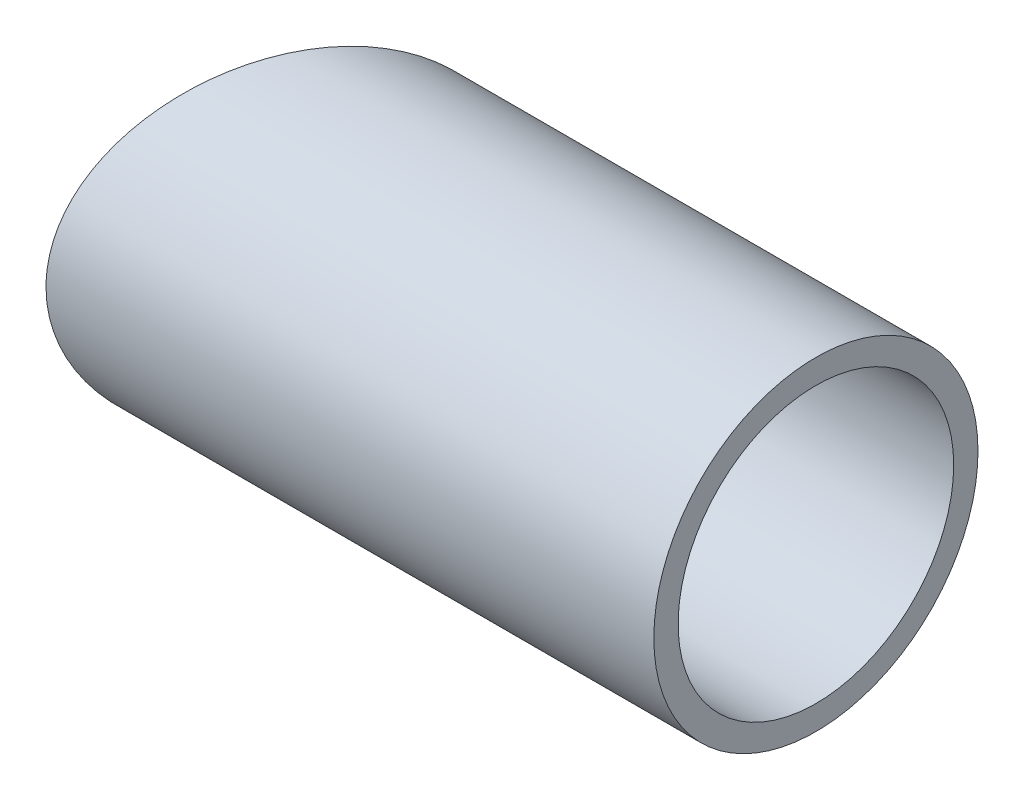
ISO-10303-21;
HEADER;
FILE_DESCRIPTION(('STEP AP214'),'2;1');
FILE_NAME('part.step','',(''),(''),'','','');
FILE_SCHEMA(('AUTOMOTIVE_DESIGN { 1 0 10303 214 1 1 1 1 }'));
ENDSEC;
DATA;
#1=APPLICATION_CONTEXT('core data for automotive mechanical design processes');
#2=APPLICATION_PROTOCOL_DEFINITION('international standard','automotive_design',2000,#1);
#3=PRODUCT_CONTEXT('',#1,'mechanical');
#4=PRODUCT('Part','Part','',(#3));
#5=PRODUCT_RELATED_PRODUCT_CATEGORY('part','',(#4));
#6=PRODUCT_DEFINITION_FORMATION('','',#4);
#7=PRODUCT_DEFINITION_CONTEXT('part definition',#1,'design');
#8=PRODUCT_DEFINITION('design','',#6,#7);
#9=PRODUCT_DEFINITION_SHAPE('','',#8);
#10=(LENGTH_UNIT() NAMED_UNIT(*) SI_UNIT(.MILLI.,.METRE.));
#11=(NAMED_UNIT(*) PLANE_ANGLE_UNIT() SI_UNIT($,.RADIAN.));
#12=(NAMED_UNIT(*) SI_UNIT($,.STERADIAN.) SOLID_ANGLE_UNIT());
#13=UNCERTAINTY_MEASURE_WITH_UNIT(LENGTH_MEASURE(1.E-05),#10,'distance_accuracy_value','');
#14=(GEOMETRIC_REPRESENTATION_CONTEXT(3) GLOBAL_UNCERTAINTY_ASSIGNED_CONTEXT((#13)) GLOBAL_UNIT_ASSIGNED_CONTEXT((#10,
#11,#12)) REPRESENTATION_CONTEXT('',''));
#15=CARTESIAN_POINT('',(0.,0.,0.));
#16=DIRECTION('',(0.,0.,1.));
#17=DIRECTION('',(1.,0.,0.));
#18=AXIS2_PLACEMENT_3D('',#15,#16,#17);
#19=CARTESIAN_POINT('',(0.,0.,0.));
#20=DIRECTION('',(1.,0.,0.));
#21=DIRECTION('',(0.,0.,-1.));
#22=AXIS2_PLACEMENT_3D('',#19,#20,#21);
#23=CYLINDRICAL_SURFACE('',#22,14.5);
#24=CARTESIAN_POINT('',(16.3809939831253,0.,-14.5));
#25=CARTESIAN_POINT('',(16.3809946959162,-0.383300686688145,-14.5000019054296));
#26=CARTESIAN_POINT('',(16.3745908659264,-0.766574805127676,-14.4847895023401));
#27=CARTESIAN_POINT('',(16.3490296321147,-1.53042286633841,-14.424098433679));
#28=CARTESIAN_POINT('',(16.3298682463773,-1.91099592855598,-14.3786103183889));
#29=CARTESIAN_POINT('',(16.2789225478894,-2.66699430461443,-14.2577652497854));
#30=CARTESIAN_POINT('',(16.2471224858534,-3.04241258884977,-14.1823710301597));
#31=CARTESIAN_POINT('',(16.1711766153359,-3.78490697328706,-14.0025133513178));
#32=CARTESIAN_POINT('',(16.1270317525825,-4.15198371020187,-13.8980521189119));
#33=CARTESIAN_POINT('',(16.0268692482308,-4.87454706440405,-13.6613699135921));
#34=CARTESIAN_POINT('',(15.9708762538626,-5.23005600125992,-13.5292065736477));
#35=CARTESIAN_POINT('',(15.847415910999,-5.92795284560127,-13.2382893602935));
#36=CARTESIAN_POINT('',(15.779948395048,-6.27034056151026,-13.0795350988244));
#37=CARTESIAN_POINT('',(15.6340816019818,-6.93980013227891,-12.7369747903166));
#38=CARTESIAN_POINT('',(15.5556848324304,-7.26687547741777,-12.5531744899572));
#39=CARTESIAN_POINT('',(15.3885311999152,-7.90391567678613,-12.1621465833349));
#40=CARTESIAN_POINT('',(15.2997741499622,-8.21388022203954,-11.9549185542345));
#41=CARTESIAN_POINT('',(15.1096858335771,-8.8241776720131,-11.51217990396));
#42=CARTESIAN_POINT('',(15.0080547074805,-9.12393278739524,-11.2760018140603));
#43=CARTESIAN_POINT('',(14.7951873985668,-9.70198279547656,-10.7826677393598));
#44=CARTESIAN_POINT('',(14.6839510767576,-9.98027737752012,-10.5255114509964));
#45=CARTESIAN_POINT('',(14.4526024714208,-10.5141641718079,-9.99223368813482));
#46=CARTESIAN_POINT('',(14.3324885512358,-10.7697521786891,-9.71610871727098));
#47=CARTESIAN_POINT('',(14.0841605194396,-11.2571272426653,-9.14699237880752));
#48=CARTESIAN_POINT('',(13.9559456865325,-11.4889121755245,-8.85399950951648));
#49=CARTESIAN_POINT('',(13.6823782554202,-11.944145944079,-8.23086370572869));
#50=CARTESIAN_POINT('',(13.5364602773459,-12.1656925641704,-7.89957847652203));
#51=CARTESIAN_POINT('',(13.2371271971376,-12.5795020303129,-7.2224367490678));
#52=CARTESIAN_POINT('',(13.0837117761607,-12.7717636295288,-6.87657963120917));
#53=CARTESIAN_POINT('',(12.7702960714774,-13.1264541262864,-6.17264705416101));
#54=CARTESIAN_POINT('',(12.6102940854993,-13.2888752516672,-5.81456844051222));
#55=CARTESIAN_POINT('',(12.2846806775711,-13.5834202120028,-5.08863001295713));
#56=CARTESIAN_POINT('',(12.1190689158323,-13.7155422079347,-4.72076960685082));
#57=CARTESIAN_POINT('',(11.7692394348529,-13.9589143381866,-3.94672690836841));
#58=CARTESIAN_POINT('',(11.5846175298596,-14.0675257338817,-3.53989606548749));
#59=CARTESIAN_POINT('',(11.2110680592332,-14.2487375012008,-2.72023463632475));
#60=CARTESIAN_POINT('',(11.0221402743378,-14.3213360346869,-2.3074037449003));
#61=CARTESIAN_POINT('',(10.6411312591823,-14.4304942442382,-1.47839281830797));
#62=CARTESIAN_POINT('',(10.4490496651508,-14.4670497328594,-1.06221239965673));
#63=CARTESIAN_POINT('',(10.0628624967841,-14.5041899018594,-0.229017269852682));
#64=CARTESIAN_POINT('',(9.86875621395787,-14.5047615372757,0.187997689053417));
#65=CARTESIAN_POINT('',(9.46757913703818,-14.4689732658152,1.04625117442154));
#66=CARTESIAN_POINT('',(9.2604577330486,-14.4302981846105,1.48737114313868));
#67=CARTESIAN_POINT('',(8.84669752975323,-14.3127276641037,2.36470169043098));
#68=CARTESIAN_POINT('',(8.64005900748852,-14.2338130654757,2.8009098291124));
#69=CARTESIAN_POINT('',(8.2288016445603,-14.0360973712538,3.66532276138109));
#70=CARTESIAN_POINT('',(8.02418335591631,-13.9172856683802,4.09352539458269));
#71=CARTESIAN_POINT('',(7.61868179794156,-13.6403143621411,4.9385663120731));
#72=CARTESIAN_POINT('',(7.41779678641621,-13.4821736344403,5.35540994184881));
#73=CARTESIAN_POINT('',(7.01899782857476,-13.1250340392629,6.17960310255039));
#74=CARTESIAN_POINT('',(6.82114508467144,-12.9255839264192,6.58678714745465));
#75=CARTESIAN_POINT('',(6.43270721665298,-12.4878432226793,7.3830990562813));
#76=CARTESIAN_POINT('',(6.24211910510711,-12.2495688148247,7.77223435696994));
#77=CARTESIAN_POINT('',(5.86995925851181,-11.7349962041275,8.5293189688615));
#78=CARTESIAN_POINT('',(5.68838858162557,-11.4586935530883,8.8972657944782));
#79=CARTESIAN_POINT('',(5.42441797997125,-11.0168640674789,9.43037723920591));
#80=CARTESIAN_POINT('',(5.3378253450958,-10.8650249808653,9.60494626171978));
#81=CARTESIAN_POINT('',(5.16763543142853,-10.5523210058855,9.94747790740062));
#82=CARTESIAN_POINT('',(5.0840393445486,-10.3914525898683,10.1154379042907));
#83=CARTESIAN_POINT('',(4.8480483652354,-9.91556719747043,10.5888353105435));
#84=CARTESIAN_POINT('',(4.69980515424703,-9.58940654293034,10.8852697726301));
#85=CARTESIAN_POINT('',(4.4168127962194,-8.90791552242776,11.4496597421407));
#86=CARTESIAN_POINT('',(4.28206152056431,-8.55258977397588,11.7176197423767));
#87=CARTESIAN_POINT('',(4.09148220460512,-7.99959667016644,12.0957156442486));
#88=CARTESIAN_POINT('',(4.02988594872312,-7.81195132223756,12.217762580765));
#89=CARTESIAN_POINT('',(3.91076069945973,-7.43032881742358,12.4535344289311));
#90=CARTESIAN_POINT('',(3.85323064876538,-7.23635332584902,12.5672615042202));
#91=CARTESIAN_POINT('',(3.68705943088629,-6.64538396374846,12.8954158413573));
#92=CARTESIAN_POINT('',(3.58479965694729,-6.23923865153228,13.096890624913));
#93=CARTESIAN_POINT('',(3.40931814671692,-5.4520361431705,13.4420723174474));
#94=CARTESIAN_POINT('',(3.33414132791918,-5.07311643775694,13.5896922344107));
#95=CARTESIAN_POINT('',(3.19977893229535,-4.30163395143526,13.8532313553298));
#96=CARTESIAN_POINT('',(3.14059215402681,-3.90907219805155,13.9691529410086));
#97=CARTESIAN_POINT('',(3.0391553299264,-3.1137168073753,14.1676634144566));
#98=CARTESIAN_POINT('',(2.99689522283411,-2.71092940011217,14.2502721037036));
#99=CARTESIAN_POINT('',(2.92994583766214,-1.89836791590614,14.3810809600144));
#100=CARTESIAN_POINT('',(2.90525526697636,-1.48859435521237,14.4292836583578));
#101=CARTESIAN_POINT('',(2.87534895589725,-0.704998209188457,14.4876609890708));
#102=CARTESIAN_POINT('',(2.86850152130362,-0.331471053049088,14.5010218853149));
#103=CARTESIAN_POINT('',(2.86961115665832,0.415459815455634,14.4988564918745));
#104=CARTESIAN_POINT('',(2.87756708199235,0.788863535132442,14.4833324356108));
#105=CARTESIAN_POINT('',(2.90816931238529,1.53269032634416,14.4235938567132));
#106=CARTESIAN_POINT('',(2.93081312905057,1.90311389201075,14.3793841939379));
#107=CARTESIAN_POINT('',(2.99047897690741,2.63832692805476,14.2628104719366));
#108=CARTESIAN_POINT('',(3.02750112240941,3.00311635361571,14.1904461888762));
#109=CARTESIAN_POINT('',(3.11436245675799,3.71570974030181,14.0204994927258));
#110=CARTESIAN_POINT('',(3.16386860255718,4.06371105742712,13.9235720752265));
#111=CARTESIAN_POINT('',(3.27549908359309,4.74967305306241,13.7047514446854));
#112=CARTESIAN_POINT('',(3.33762307895978,5.08763400173528,13.5828589040946));
#113=CARTESIAN_POINT('',(3.47378472648587,5.7515600721652,13.3153170905227));
#114=CARTESIAN_POINT('',(3.54782350124679,6.07752406001836,13.1696655789716));
#115=CARTESIAN_POINT('',(3.70701677141793,6.71566947195299,12.8559794515498));
#116=CARTESIAN_POINT('',(3.79217171147029,7.02785034404659,12.6879439403227));
#117=CARTESIAN_POINT('',(3.97746382134982,7.65280096459994,12.3216305520166));
#118=CARTESIAN_POINT('',(4.07815109362172,7.96475047509563,12.1222317606635));
#119=CARTESIAN_POINT('',(4.28986476527447,8.57017164545629,11.702048930854));
#120=CARTESIAN_POINT('',(4.40089143248615,8.86364282632987,11.4812643384156));
#121=CARTESIAN_POINT('',(4.63227384461312,9.43090922764918,11.0200548485505));
#122=CARTESIAN_POINT('',(4.75263173024259,9.70469990517844,10.7796254436386));
#123=CARTESIAN_POINT('',(5.00163647991634,10.2315108468576,10.2809419954176));
#124=CARTESIAN_POINT('',(5.13028419459949,10.4845289734102,10.0226861226984));
#125=CARTESIAN_POINT('',(5.40781581598612,10.992638161514,9.46404091640482));
#126=CARTESIAN_POINT('',(5.55744796594634,11.2455084044826,9.1620017216133));
#127=CARTESIAN_POINT('',(5.86421163582246,11.7242501677717,8.54082831019162));
#128=CARTESIAN_POINT('',(6.02134357517259,11.950120175592,8.22169313732708));
#129=CARTESIAN_POINT('',(6.34193333989926,12.3741983087562,7.56841548434909));
#130=CARTESIAN_POINT('',(6.50539313610819,12.5723977260137,7.23426832341434));
#131=CARTESIAN_POINT('',(6.83743403139671,12.9404773073779,6.55316100670932));
#132=CARTESIAN_POINT('',(7.0060154666052,13.1103556080261,6.20620000965407));
#133=CARTESIAN_POINT('',(7.36439282107158,13.4369923155273,5.46598152952295));
#134=CARTESIAN_POINT('',(7.55461441568394,13.5907027235753,5.07158242749195));
#135=CARTESIAN_POINT('',(7.93851518244687,13.8627165820832,4.27238720165425));
#136=CARTESIAN_POINT('',(8.13219456895602,13.9810178292932,3.86759043257862));
#137=CARTESIAN_POINT('',(8.52169366648058,14.181810745793,3.05014667246381));
#138=CARTESIAN_POINT('',(8.71751368415182,14.2642972136561,2.63749855024012));
#139=CARTESIAN_POINT('',(9.11004292005992,14.3931249914863,1.80684083670564));
#140=CARTESIAN_POINT('',(9.30675243401575,14.4394532308259,1.38882936207626));
#141=CARTESIAN_POINT('',(9.71175173945161,14.4973695376621,0.524530194572675));
#142=CARTESIAN_POINT('',(9.92001517315151,14.5066634721632,0.0780745344994468));
#143=CARTESIAN_POINT('',(10.3346919621586,14.4839742708939,-0.814907828537915));
#144=CARTESIAN_POINT('',(10.5411043789899,14.4519712705674,-1.2614344623106));
#145=CARTESIAN_POINT('',(10.9505684522113,14.3465308854295,-2.15122924525404));
#146=CARTESIAN_POINT('',(11.1536195552847,14.2730867473209,-2.59449685139986));
#147=CARTESIAN_POINT('',(11.5547811374543,14.0848268698686,-3.47417148122685));
#148=CARTESIAN_POINT('',(11.7528940443925,13.9700319072402,-3.9105818356151));
#149=CARTESIAN_POINT('',(12.1422478347874,13.6996656747065,-4.77203515118858));
#150=CARTESIAN_POINT('',(12.3335077457588,13.5442191874713,-5.19710858605802));
#151=CARTESIAN_POINT('',(12.7082485897474,13.1928911053632,-6.03351620518596));
#152=CARTESIAN_POINT('',(12.8917328099484,12.9970268069273,-6.44485617936082));
#153=CARTESIAN_POINT('',(13.2495733371929,12.5654643970178,-7.25036355165505));
#154=CARTESIAN_POINT('',(13.4239299340034,12.3297675510808,-7.64453149485392));
#155=CARTESIAN_POINT('',(13.6774221763355,11.9472762337643,-8.21983372892234));
#156=CARTESIAN_POINT('',(13.7605796536601,11.8149538491554,-8.40894401688279));
#157=CARTESIAN_POINT('',(13.9240850006538,11.5407539710878,-8.78148681607024));
#158=CARTESIAN_POINT('',(14.0044318198536,11.398872961901,-8.96491720158253));
#159=CARTESIAN_POINT('',(14.2309309894113,10.977821879732,-9.48297118812857));
#160=CARTESIAN_POINT('',(14.3733114823584,10.6869085053729,-9.80982189081073));
#161=CARTESIAN_POINT('',(14.6461987455505,10.0740005391492,-10.4382559349526));
#162=CARTESIAN_POINT('',(14.7767067140675,9.75200909071285,-10.7398418260995));
#163=CARTESIAN_POINT('',(15.0246859183433,9.07892760838606,-11.3145414808481));
#164=CARTESIAN_POINT('',(15.1421586635959,8.72784095199672,-11.5876585409508));
#165=CARTESIAN_POINT('',(15.3629261329648,7.99903920610276,-12.1022439532683));
#166=CARTESIAN_POINT('',(15.4662224388294,7.62132709448586,-12.3437158361849));
#167=CARTESIAN_POINT('',(15.6491447690023,6.87656778689885,-12.7722672294406));
#168=CARTESIAN_POINT('',(15.7300543343178,6.51151200037751,-12.9622643561113));
#169=CARTESIAN_POINT('',(15.8784674387067,5.76432679602124,-13.3113684694714));
#170=CARTESIAN_POINT('',(15.9459725451439,5.38219938075526,-13.4704790676288));
#171=CARTESIAN_POINT('',(16.0668375351725,4.60443027519517,-13.755744112301));
#172=CARTESIAN_POINT('',(16.1202218547852,4.2088132862427,-13.8819554853486));
#173=CARTESIAN_POINT('',(16.2124558378884,3.40678178847111,-14.1002301278002));
#174=CARTESIAN_POINT('',(16.2513113921738,3.00037172752454,-14.1923072370626));
#175=CARTESIAN_POINT('',(16.3153538010869,2.1639441458994,-14.344162525669));
#176=CARTESIAN_POINT('',(16.3399464005561,1.73362509628886,-14.4025360880055));
#177=CARTESIAN_POINT('',(16.3727658941194,0.868859257123431,-14.4804532862228));
#178=CARTESIAN_POINT('',(16.3809931752861,0.434412565439799,-14.4999978404877));
#179=CARTESIAN_POINT('',(16.3809939831253,0.,-14.5));
#180=B_SPLINE_CURVE_WITH_KNOTS('',3,(#24,#25,#26,#27,#28,#29,#30,#31,#32,#33,#34,#35,#36,#37,
#38,#39,#40,#41,#42,#43,#44,#45,#46,#47,#48,#49,#50,#51,#52,#53,#54,#55,#56,#57,#58,#59,#60,#61,
#62,#63,#64,#65,#66,#67,#68,#69,#70,#71,#72,#73,#74,#75,#76,#77,#78,#79,#80,#81,#82,#83,#84,#85,
#86,#87,#88,#89,#90,#91,#92,#93,#94,#95,#96,#97,#98,#99,#100,#101,#102,#103,#104,#105,#106,#107,
#108,#109,#110,#111,#112,#113,#114,#115,#116,#117,#118,#119,#120,#121,#122,#123,#124,#125,#126,
#127,#128,#129,#130,#131,#132,#133,#134,#135,#136,#137,#138,#139,#140,#141,#142,#143,#144,#145,
#146,#147,#148,#149,#150,#151,#152,#153,#154,#155,#156,#157,#158,#159,#160,#161,#162,#163,#164,
#165,#166,#167,#168,#169,#170,#171,#172,#173,#174,#175,#176,#177,#178,#179),.UNSPECIFIED.,.T.,
.F.,(4,2,2,2,2,2,2,2,2,2,2,2,2,2,2,2,2,2,2,2,2,2,2,2,2,2,2,2,2,2,2,2,2,2,2,2,2,2,2,2,2,2,2,2,2,
2,2,2,2,2,2,2,2,2,2,2,2,2,2,2,2,2,2,2,2,2,2,2,2,2,2,2,2,2,2,2,2,4),(0.,1.14950227790959,
2.29936350923044,3.45066211887194,4.60187255233285,5.75071130393991,6.89956682278981,
8.04815918535376,9.19677228169887,10.3802439172339,11.5637326811004,12.7474401776178,
13.9312532190239,15.2031142197187,16.4750293558818,17.7472753030783,19.0195984495377,
20.3974110079168,21.7752938841999,23.1533368226484,24.531879330023,25.9967565862263,
27.4623319696965,28.9282973086045,30.3935604218769,31.8757642685102,33.3573518646356,
34.8391129108608,35.5799934927737,36.3211655703427,37.7141697397927,39.1069537882241,
39.8032065581657,40.4992776141665,41.8910108848166,43.1300260724787,44.3689481384444,
45.6071326889179,46.8452261356547,47.9653305462475,49.0853483525658,50.2051764572166,
51.3250134648968,52.4176592976476,53.5102757031708,54.6029951145243,55.6957582476147,
56.8455750328765,57.995421611188,59.1455327657065,60.2957621243482,61.5585681454228,
62.8214448732997,64.0847181438121,65.3480745017609,66.7387622773868,68.1295365672378,
69.5205127735253,70.9119915631191,72.3884399525516,73.8655988045872,75.3429984457434,
76.8196568007512,78.2918345951782,79.7633836860888,81.2348860325844,81.970646602996,
82.7066792844349,84.0851246311916,85.4634306992944,86.8415769910235,88.2195693896722,
89.4761770702198,90.7326377308299,91.9869096467485,93.2406724560156,94.5434878751235,
95.84627247966),.UNSPECIFIED.);
#181=CARTESIAN_POINT('',(16.3809939831253,0.,-14.5));
#182=VERTEX_POINT('',#181);
#183=EDGE_CURVE('E47',#182,#182,#180,.T.);
#184=ORIENTED_EDGE('',*,*,#183,.T.);
#185=EDGE_LOOP('',(#184));
#186=FACE_BOUND('',#185,.T.);
#187=CARTESIAN_POINT('',(50.,0.,0.));
#188=DIRECTION('',(1.,0.,0.));
#189=DIRECTION('',(0.,0.,-1.));
#190=AXIS2_PLACEMENT_3D('',#187,#188,#189);
#191=CIRCLE('',#190,14.5);
#192=CARTESIAN_POINT('',(50.,0.,-14.5));
#193=VERTEX_POINT('',#192);
#194=EDGE_CURVE('E35',#193,#193,#191,.F.);
#195=ORIENTED_EDGE('',*,*,#194,.F.);
#196=EDGE_LOOP('',(#195));
#197=FACE_BOUND('',#196,.T.);
#198=ADVANCED_FACE('F30',(#186,#197),#23,.F.);
#199=CARTESIAN_POINT('',(75.,0.,0.));
#200=DIRECTION('',(-1.,0.,0.));
#201=DIRECTION('',(0.,0.,1.));
#202=AXIS2_PLACEMENT_3D('',#199,#200,#201);
#203=CYLINDRICAL_SURFACE('',#202,20.);
#204=CARTESIAN_POINT('',(75.,0.,0.));
#205=DIRECTION('',(1.,0.,0.));
#206=DIRECTION('',(0.,0.,-1.));
#207=AXIS2_PLACEMENT_3D('',#204,#205,#206);
#208=CIRCLE('',#207,20.);
#209=CARTESIAN_POINT('',(75.,0.,-20.));
#210=VERTEX_POINT('',#209);
#211=EDGE_CURVE('E10',#210,#210,#208,.T.);
#212=ORIENTED_EDGE('',*,*,#211,.F.);
#213=EDGE_LOOP('',(#212));
#214=FACE_BOUND('',#213,.T.);
#215=CARTESIAN_POINT('',(0.,0.,20.));
#216=CARTESIAN_POINT('',(-1.94265528875059E-06,-0.515347152712929,20.0000033435976));
#217=CARTESIAN_POINT('',(0.0105872618077806,-1.03065619560562,19.9800626748571));
#218=CARTESIAN_POINT('',(0.0527873965210825,-2.05752211883411,19.9005485879433));
#219=CARTESIAN_POINT('',(0.0844051407387472,-2.56907772858862,19.8409623232361));
#220=CARTESIAN_POINT('',(0.168258113312793,-3.58506412917509,19.6827841907049));
#221=CARTESIAN_POINT('',(0.220519623694897,-4.08948498532795,19.5841426003247));
#222=CARTESIAN_POINT('',(0.344904911222331,-5.08688124538142,19.3490604890745));
#223=CARTESIAN_POINT('',(0.417027178267763,-5.57985751637492,19.2126228419986));
#224=CARTESIAN_POINT('',(0.579891155418372,-6.54954216671725,18.9040095619525));
#225=CARTESIAN_POINT('',(0.67057309752148,-7.02629717492819,18.7319486270877));
#226=CARTESIAN_POINT('',(0.869537693079961,-7.96224332604402,18.3536773437833));
#227=CARTESIAN_POINT('',(0.977820601359865,-8.42143421453892,18.1474665009249));
#228=CARTESIAN_POINT('',(1.21067581350587,-9.31959392597049,17.7029996121072));
#229=CARTESIAN_POINT('',(1.33524505318754,-9.75856653191003,17.4647495939036));
#230=CARTESIAN_POINT('',(1.59933138957118,-10.6142212024876,16.9583461404528));
#231=CARTESIAN_POINT('',(1.73884993728176,-11.0309010974565,16.6901898023373));
#232=CARTESIAN_POINT('',(2.03867417676876,-11.860132628633,16.1122669821214));
#233=CARTESIAN_POINT('',(2.19966721267117,-12.2714574103333,15.8010973386587));
#234=CARTESIAN_POINT('',(2.53493807052053,-13.065695477145,15.150941100807));
#235=CARTESIAN_POINT('',(2.70921621889399,-13.4486080636883,14.8119538228993));
#236=CARTESIAN_POINT('',(3.06950846190497,-14.1846710234823,14.1086597064266));
#237=CARTESIAN_POINT('',(3.25552562029986,-14.5378135704259,13.7443462554572));
#238=CARTESIAN_POINT('',(3.6377192886177,-15.2130686709126,12.9929873039803));
#239=CARTESIAN_POINT('',(3.8338966389847,-15.5351786511396,12.6059399225815));
#240=CARTESIAN_POINT('',(4.25707080007299,-16.1811996336306,11.7677017232061));
#241=CARTESIAN_POINT('',(4.4850792261149,-16.5013845828709,11.3141465448498));
#242=CARTESIAN_POINT('',(4.94986642275898,-17.1012300498544,10.3852610473022));
#243=CARTESIAN_POINT('',(5.18664574558267,-17.3808880105275,9.90992935659955));
#244=CARTESIAN_POINT('',(5.66723643198369,-17.8989032290494,8.94043748669027));
#245=CARTESIAN_POINT('',(5.91105025905306,-18.1372458082982,8.44627069146967));
#246=CARTESIAN_POINT('',(6.40391694771839,-18.5718055479788,7.4422644369345));
#247=CARTESIAN_POINT('',(6.65297013960949,-18.7680200438208,6.93242398859579));
#248=CARTESIAN_POINT('',(7.17872329930853,-19.1344672199018,5.85054045345196));
#249=CARTESIAN_POINT('',(7.45578633342934,-19.3004107712202,5.27721708696384));
#250=CARTESIAN_POINT('',(8.01220539414903,-19.580299258167,4.1190793969173));
#251=CARTESIAN_POINT('',(8.29156156178783,-19.6942409706385,3.53426436342965));
#252=CARTESIAN_POINT('',(8.85067603063716,-19.8695713119964,2.35681004847789));
#253=CARTESIAN_POINT('',(9.1304344236759,-19.9309449733016,1.76416858735275));
#254=CARTESIAN_POINT('',(9.68842427748864,-20.0006012826451,0.574979465272021));
#255=CARTESIAN_POINT('',(9.96665575858663,-20.0088846390639,-0.0215681434577852));
#256=CARTESIAN_POINT('',(10.3871138914183,-19.9808514928967,-0.928530123916199));
#257=CARTESIAN_POINT('',(10.5306192443282,-19.9640061753286,-1.2390644699985));
#258=CARTESIAN_POINT('',(10.8164216631048,-19.9158016957824,-1.85947133995911));
#259=CARTESIAN_POINT('',(10.9587190027188,-19.8844459165368,-2.16934400118669));
#260=CARTESIAN_POINT('',(11.383503024419,-19.7685428452942,-3.09729693227819));
#261=CARTESIAN_POINT('',(11.6639021533422,-19.6621584724452,-3.71375625499837));
#262=CARTESIAN_POINT('',(12.216938599118,-19.3911460178353,-4.93722105577405));
#263=CARTESIAN_POINT('',(12.4895757849411,-19.2265169534743,-5.54422637415812));
#264=CARTESIAN_POINT('',(13.0251154488665,-18.8392428705016,-6.74389508648322));
#265=CARTESIAN_POINT('',(13.2880183295603,-18.6166002542827,-7.3365590732011));
#266=CARTESIAN_POINT('',(13.7948974198867,-18.1209157861837,-8.48605852250537));
#267=CARTESIAN_POINT('',(14.0391970566176,-17.8494536637681,-9.04343227777653));
#268=CARTESIAN_POINT('',(14.5148583725828,-17.2532153061575,-10.1347488452607));
#269=CARTESIAN_POINT('',(14.7462200656132,-16.9284391278149,-10.6686916824588));
#270=CARTESIAN_POINT('',(15.1940871780251,-16.2271343267261,-11.7078127140302));
#271=CARTESIAN_POINT('',(15.4105975699691,-15.850623154124,-12.2130005265199));
#272=CARTESIAN_POINT('',(15.8270203138561,-15.0477920623863,-13.1895177959505));
#273=CARTESIAN_POINT('',(16.0269340664412,-14.6214763537353,-13.6608501096088));
#274=CARTESIAN_POINT('',(16.3938600265806,-13.7560084795524,-14.5299409978297));
#275=CARTESIAN_POINT('',(16.5622184246424,-13.3203060096676,-14.9305690418174));
#276=CARTESIAN_POINT('',(16.8819157260814,-12.4113454909011,-15.6942919547482));
#277=CARTESIAN_POINT('',(17.033255356265,-11.9380890472792,-16.0573884264676));
#278=CARTESIAN_POINT('',(17.3175749556226,-10.9574720930264,-16.7418993727344));
#279=CARTESIAN_POINT('',(17.4505631527053,-10.4501270188217,-17.063332523182));
#280=CARTESIAN_POINT('',(17.6970783373475,-9.40496417376245,-17.6609436211351));
#281=CARTESIAN_POINT('',(17.8106068042764,-8.86714872346934,-17.937125008704));
#282=CARTESIAN_POINT('',(18.008470779226,-7.81178032520542,-18.4196612378014));
#283=CARTESIAN_POINT('',(18.0944581065611,-7.29632478250241,-18.6299343188199));
#284=CARTESIAN_POINT('',(18.2485432751699,-6.24729185442384,-19.0074201099763));
#285=CARTESIAN_POINT('',(18.3166421816409,-5.71371555021843,-19.174635384055));
#286=CARTESIAN_POINT('',(18.4343702817611,-4.63269088568122,-19.4641000233889));
#287=CARTESIAN_POINT('',(18.48400537329,-4.08524701483779,-19.5863637473318));
#288=CARTESIAN_POINT('',(18.5644157849745,-2.98067638940546,-19.7845992387072));
#289=CARTESIAN_POINT('',(18.595191745385,-2.42354996419321,-19.8605725776667));
#290=CARTESIAN_POINT('',(18.6364031634912,-1.33633217151089,-19.9623394568975));
#291=CARTESIAN_POINT('',(18.6479052377414,-0.806525625009227,-19.9907641657398));
#292=CARTESIAN_POINT('',(18.6538350813877,0.25375150285211,-20.0054161615426));
#293=CARTESIAN_POINT('',(18.6482636356259,0.784222052568136,-19.991645388161));
#294=CARTESIAN_POINT('',(18.6200921361969,1.84186798855017,-19.9220571599331));
#295=CARTESIAN_POINT('',(18.5974942986621,2.36904379465242,-19.8662451771146));
#296=CARTESIAN_POINT('',(18.5354457180815,3.41633466678577,-19.7131610344232));
#297=CARTESIAN_POINT('',(18.4959949228744,3.93644971095811,-19.6158887462273));
#298=CARTESIAN_POINT('',(18.4012575065749,4.95815790877726,-19.3826499150328));
#299=CARTESIAN_POINT('',(18.3462176865918,5.45991193103616,-19.247286619053));
#300=CARTESIAN_POINT('',(18.2204766190954,6.44957985658089,-18.93862708431));
#301=CARTESIAN_POINT('',(18.1497756411914,6.93749399795945,-18.765331498558));
#302=CARTESIAN_POINT('',(17.9932069815099,7.89635471637173,-18.3824400675249));
#303=CARTESIAN_POINT('',(17.9073387912842,8.36730072394788,-18.1728430053196));
#304=CARTESIAN_POINT('',(17.7210235239952,9.28932573691698,-17.7192667407285));
#305=CARTESIAN_POINT('',(17.6205760974244,9.74040426568953,-17.4752867140852));
#306=CARTESIAN_POINT('',(17.4028065268734,10.6322020205833,-16.9479192780778));
#307=CARTESIAN_POINT('',(17.2850958663016,11.0722939190894,-16.6636317019513));
#308=CARTESIAN_POINT('',(17.0357731843132,11.9262435645519,-16.0635324528317));
#309=CARTESIAN_POINT('',(16.904160995897,12.3401009962568,-15.747720401136));
#310=CARTESIAN_POINT('',(16.6278609283057,13.1394848233779,-15.0871738986207));
#311=CARTESIAN_POINT('',(16.483171035827,13.5250068399551,-14.7424349951192));
#312=CARTESIAN_POINT('',(16.1816221709408,14.2658268875587,-14.026811792581));
#313=CARTESIAN_POINT('',(16.0247627954919,14.6211239167453,-13.6559266276429));
#314=CARTESIAN_POINT('',(15.6898258056235,15.3208008294709,-12.867310806569));
#315=CARTESIAN_POINT('',(15.5110368916457,15.6631750108441,-12.4481021585857));
#316=CARTESIAN_POINT('',(15.1419168847036,16.3107113070758,-11.5866766781603));
#317=CARTESIAN_POINT('',(14.9515853921416,16.6158721325257,-11.1444590492351));
#318=CARTESIAN_POINT('',(14.560485540827,17.1879202416392,-10.2401994972449));
#319=CARTESIAN_POINT('',(14.3597150304099,17.4547995918702,-9.77815349065889));
#320=CARTESIAN_POINT('',(13.9489138877371,17.9494041521425,-8.83749469198853));
#321=CARTESIAN_POINT('',(13.7388824390668,18.1771259014694,-8.35888044010322));
#322=CARTESIAN_POINT('',(13.2936972557462,18.6093528902009,-7.34961201704839));
#323=CARTESIAN_POINT('',(13.0578736237303,18.8105740704794,-6.81784526494235));
#324=CARTESIAN_POINT('',(12.5782450982245,19.1662592007338,-5.74241487149884));
#325=CARTESIAN_POINT('',(12.3344398255179,19.3207209255322,-5.19875066530791));
#326=CARTESIAN_POINT('',(11.8402351779799,19.5827180387448,-4.10299308417951));
#327=CARTESIAN_POINT('',(11.5898339937455,19.6902404054747,-3.55089741413427));
#328=CARTESIAN_POINT('',(11.0839679325057,19.8582897276934,-2.44191196989566));
#329=CARTESIAN_POINT('',(10.8285028159287,19.9188144542832,-1.88502196959375));
#330=CARTESIAN_POINT('',(10.2949119766654,19.9957359287372,-0.728473348366619));
#331=CARTESIAN_POINT('',(10.0165070457068,20.0085401603873,-0.128696105425053));
#332=CARTESIAN_POINT('',(9.59725742527289,19.987452347859,0.769036502937857));
#333=CARTESIAN_POINT('',(9.45722414192206,19.9737050477385,1.06797902899939));
#334=CARTESIAN_POINT('',(9.1767837754636,19.9328305084613,1.66486196576283));
#335=CARTESIAN_POINT('',(9.03637661183981,19.9057001081146,1.96280212294887));
#336=CARTESIAN_POINT('',(8.61496954475418,19.8043050826567,2.85434278665293));
#337=CARTESIAN_POINT('',(8.33377263102121,19.7100360521397,3.44568796610265));
#338=CARTESIAN_POINT('',(7.77291851893906,19.4686929250939,4.6182562133055));
#339=CARTESIAN_POINT('',(7.49326133064998,19.3216184839653,5.19947921497694));
#340=CARTESIAN_POINT('',(7.07143484609421,19.0587773991595,6.07121571651912));
#341=CARTESIAN_POINT('',(6.92791625928961,18.9620464870751,6.36692363614122));
#342=CARTESIAN_POINT('',(6.64217280367778,18.7547114538352,6.95396861743234));
#343=CARTESIAN_POINT('',(6.49994762431748,18.6441107625389,7.24530673983546));
#344=CARTESIAN_POINT('',(6.07571386036377,18.2917106095027,8.11184532781994));
#345=CARTESIAN_POINT('',(5.79598956267203,18.0292151163095,8.67989531162042));
#346=CARTESIAN_POINT('',(5.24520110075504,17.4500045414447,9.79238046879462));
#347=CARTESIAN_POINT('',(4.9741397486903,17.1332720613324,10.3368079939648));
#348=CARTESIAN_POINT('',(4.57623895834648,16.6186582574323,11.1319319389074));
#349=CARTESIAN_POINT('',(4.44505279377885,16.4405327478367,11.3933892188701));
#350=CARTESIAN_POINT('',(4.18585363028653,16.071202345646,11.9086939763176));
#351=CARTESIAN_POINT('',(4.05784184565661,15.8799925499487,12.1625385492591));
#352=CARTESIAN_POINT('',(3.6874390145463,15.3000428549986,12.8952698091205));
#353=CARTESIAN_POINT('',(3.44991853752121,14.893649905077,13.3628451732062));
#354=CARTESIAN_POINT('',(2.99114075523668,14.0348646840352,14.2621624038802));
#355=CARTESIAN_POINT('',(2.76988165079723,13.5824775150173,14.6939082353806));
#356=CARTESIAN_POINT('',(2.34645923675275,12.6339711080263,15.5169808897414));
#357=CARTESIAN_POINT('',(2.1442925901413,12.1378595416776,15.9083147769795));
#358=CARTESIAN_POINT('',(1.85771215801737,11.3635498078663,16.4611790976073));
#359=CARTESIAN_POINT('',(1.76496601064172,11.1004307651457,16.6397731801168));
#360=CARTESIAN_POINT('',(1.58532851984129,10.564425487676,16.9851283595243));
#361=CARTESIAN_POINT('',(1.49843963419377,10.2915352254452,17.1518844906148));
#362=CARTESIAN_POINT('',(1.26408551095911,9.51511936932556,17.6009823307682));
#363=CARTESIAN_POINT('',(1.12360269982167,9.00130121347702,17.8693873910944));
#364=CARTESIAN_POINT('',(0.865064533386649,7.94764663551049,18.362272339808));
#365=CARTESIAN_POINT('',(0.747005230707495,7.40781481379291,18.5867599595273));
#366=CARTESIAN_POINT('',(0.588293006330448,6.58240556335254,18.8880281737425));
#367=CARTESIAN_POINT('',(0.538487171477766,6.30490771430773,18.9824734177202));
#368=CARTESIAN_POINT('',(0.445154121232677,5.74514794630966,19.1593167680283));
#369=CARTESIAN_POINT('',(0.401625215781717,5.46288733267612,19.2417181172499));
#370=CARTESIAN_POINT('',(0.280774540416589,4.6099889382359,19.4703388796597));
#371=CARTESIAN_POINT('',(0.213117958510329,4.03286737768312,19.5981093374764));
#372=CARTESIAN_POINT('',(0.106342641823232,2.88234583969696,19.7996069912223));
#373=CARTESIAN_POINT('',(0.0665285413575638,2.30923830883151,19.8746512672745));
#374=CARTESIAN_POINT('',(0.0133585502503461,1.15740443348268,19.9748454435077));
#375=CARTESIAN_POINT('',(2.18138829684242E-06,0.578678190746879,19.9999962455075));
#376=CARTESIAN_POINT('',(0.,0.,20.));
#377=B_SPLINE_CURVE_WITH_KNOTS('',3,(#215,#216,#217,#218,#219,#220,#221,#222,#223,#224,#225,
#226,#227,#228,#229,#230,#231,#232,#233,#234,#235,#236,#237,#238,#239,#240,#241,#242,#243,#244,
#245,#246,#247,#248,#249,#250,#251,#252,#253,#254,#255,#256,#257,#258,#259,#260,#261,#262,#263,
#264,#265,#266,#267,#268,#269,#270,#271,#272,#273,#274,#275,#276,#277,#278,#279,#280,#281,#282,
#283,#284,#285,#286,#287,#288,#289,#290,#291,#292,#293,#294,#295,#296,#297,#298,#299,#300,#301,
#302,#303,#304,#305,#306,#307,#308,#309,#310,#311,#312,#313,#314,#315,#316,#317,#318,#319,#320,
#321,#322,#323,#324,#325,#326,#327,#328,#329,#330,#331,#332,#333,#334,#335,#336,#337,#338,#339,
#340,#341,#342,#343,#344,#345,#346,#347,#348,#349,#350,#351,#352,#353,#354,#355,#356,#357,#358,
#359,#360,#361,#362,#363,#364,#365,#366,#367,#368,#369,#370,#371,#372,#373,#374,#375,#376),
.UNSPECIFIED.,.T.,.F.,(4,2,2,2,2,2,2,2,2,2,2,2,2,2,2,2,2,2,2,2,2,2,2,2,2,2,2,2,2,2,2,2,2,2,2,2,
2,2,2,2,2,2,2,2,2,2,2,2,2,2,2,2,2,2,2,2,2,2,2,2,2,2,2,2,2,2,2,2,2,2,2,2,2,2,2,2,2,2,2,2,4),(0.,
1.54548402689867,3.09146908772534,4.63942875227,6.18727075117644,7.73020449918077,
9.27316058757207,10.8158267938287,12.3586428701085,13.9778805396586,15.5971580080874,
17.2168598527269,18.8366958926404,20.6353374782095,22.4340925005798,24.2334852837299,
26.0329918444778,28.004870894708,29.9768721485569,31.9494346993516,33.9219709303177,
34.9492106808271,35.9762110779391,38.0300664557646,40.0839564842151,42.1377614727681,
44.1342560324239,46.1307484630956,48.1265691251018,50.1222211820006,51.9659025298526,
53.8095051112052,55.6522784044699,57.4949115440575,59.1826418511948,60.8702716366808,
62.5573618802495,64.244394845064,65.8345448287451,67.4246217169033,69.0144916785262,
70.6043665609607,72.170357142903,73.7363207681556,75.3023368989343,76.8683905779674,
78.4775694244725,80.0867676043187,81.6962139424637,83.3057136066694,85.0139165143679,
86.7221785929157,88.4307941808927,90.1395606972896,91.9841479310895,93.8288229308645,
95.674009346552,97.5192832662661,99.5009549267676,100.491927336361,101.483133933329,
103.465466294932,105.447811593161,106.475435455214,107.502805695318,109.556426560992,
111.610707436869,112.637865810692,113.665411224185,115.652922473187,117.640213489203,
119.627156518383,120.620571379764,121.614400528048,123.401192898552,125.187670434216,
126.079355217344,126.970799464924,128.752500869974,130.487940876388,132.223349514635),.UNSPECIFIED.);
#378=CARTESIAN_POINT('',(0.,0.,20.));
#379=VERTEX_POINT('',#378);
#380=EDGE_CURVE('E57',#379,#379,#377,.T.);
#381=ORIENTED_EDGE('',*,*,#380,.T.);
#382=EDGE_LOOP('',(#381));
#383=FACE_BOUND('',#382,.T.);
#384=ADVANCED_FACE('F32',(#214,#383),#203,.T.);
#385=CARTESIAN_POINT('',(75.,0.,0.));
#386=DIRECTION('',(1.,0.,0.));
#387=DIRECTION('',(0.,0.,-1.));
#388=AXIS2_PLACEMENT_3D('',#385,#386,#387);
#389=PLANE('',#388);
#390=CARTESIAN_POINT('',(75.,0.,0.));
#391=DIRECTION('',(1.,0.,0.));
#392=DIRECTION('',(0.,0.,-1.));
#393=AXIS2_PLACEMENT_3D('',#390,#391,#392);
#394=CIRCLE('',#393,17.);
#395=CARTESIAN_POINT('',(75.,0.,-17.));
#396=VERTEX_POINT('',#395);
#397=EDGE_CURVE('E44',#396,#396,#394,.T.);
#398=ORIENTED_EDGE('',*,*,#397,.F.);
#399=EDGE_LOOP('',(#398));
#400=FACE_BOUND('',#399,.T.);
#401=ORIENTED_EDGE('',*,*,#211,.T.);
#402=EDGE_LOOP('',(#401));
#403=FACE_BOUND('',#402,.T.);
#404=ADVANCED_FACE('F72',(#400,#403),#389,.T.);
#405=CARTESIAN_POINT('',(50.,0.,0.));
#406=DIRECTION('',(1.,0.,0.));
#407=DIRECTION('',(0.,0.,-1.));
#408=AXIS2_PLACEMENT_3D('',#405,#406,#407);
#409=PLANE('',#408);
#410=CARTESIAN_POINT('',(50.,0.,0.));
#411=DIRECTION('',(1.,0.,0.));
#412=DIRECTION('',(0.,0.,-1.));
#413=AXIS2_PLACEMENT_3D('',#410,#411,#412);
#414=CIRCLE('',#413,17.);
#415=CARTESIAN_POINT('',(50.,0.,-17.));
#416=VERTEX_POINT('',#415);
#417=EDGE_CURVE('E42',#416,#416,#414,.T.);
#418=ORIENTED_EDGE('',*,*,#417,.T.);
#419=EDGE_LOOP('',(#418));
#420=FACE_BOUND('',#419,.T.);
#421=ORIENTED_EDGE('',*,*,#194,.T.);
#422=EDGE_LOOP('',(#421));
#423=FACE_BOUND('',#422,.T.);
#424=ADVANCED_FACE('F69',(#420,#423),#409,.T.);
#425=CARTESIAN_POINT('',(50.,0.,0.));
#426=DIRECTION('',(1.,0.,0.));
#427=DIRECTION('',(0.,0.,-1.));
#428=AXIS2_PLACEMENT_3D('',#425,#426,#427);
#429=CYLINDRICAL_SURFACE('',#428,17.);
#430=ORIENTED_EDGE('',*,*,#417,.F.);
#431=EDGE_LOOP('',(#430));
#432=FACE_BOUND('',#431,.T.);
#433=ORIENTED_EDGE('',*,*,#397,.T.);
#434=EDGE_LOOP('',(#433));
#435=FACE_BOUND('',#434,.T.);
#436=ADVANCED_FACE('F67',(#432,#435),#429,.F.);
#437=CARTESIAN_POINT('',(-376.699150516695,-20.,-180.));
#438=DIRECTION('',(0.,1.,0.));
#439=DIRECTION('',(0.,0.,1.));
#440=AXIS2_PLACEMENT_3D('',#437,#438,#439);
#441=CYLINDRICAL_SURFACE('',#440,426.5);
#442=ORIENTED_EDGE('',*,*,#380,.F.);
#443=EDGE_LOOP('',(#442));
#444=FACE_BOUND('',#443,.T.);
#445=ORIENTED_EDGE('',*,*,#183,.F.);
#446=EDGE_LOOP('',(#445));
#447=FACE_BOUND('',#446,.T.);
#448=ADVANCED_FACE('F63',(#444,#447),#441,.F.);
#449=CLOSED_SHELL('',(#198,#384,#404,#424,#436,#448));
#450=MANIFOLD_SOLID_BREP('B2',#449);
#451=ADVANCED_BREP_SHAPE_REPRESENTATION('',(#18,#450),#14);
#452=SHAPE_DEFINITION_REPRESENTATION(#9,#451);
ENDSEC;
END-ISO-10303-21;
